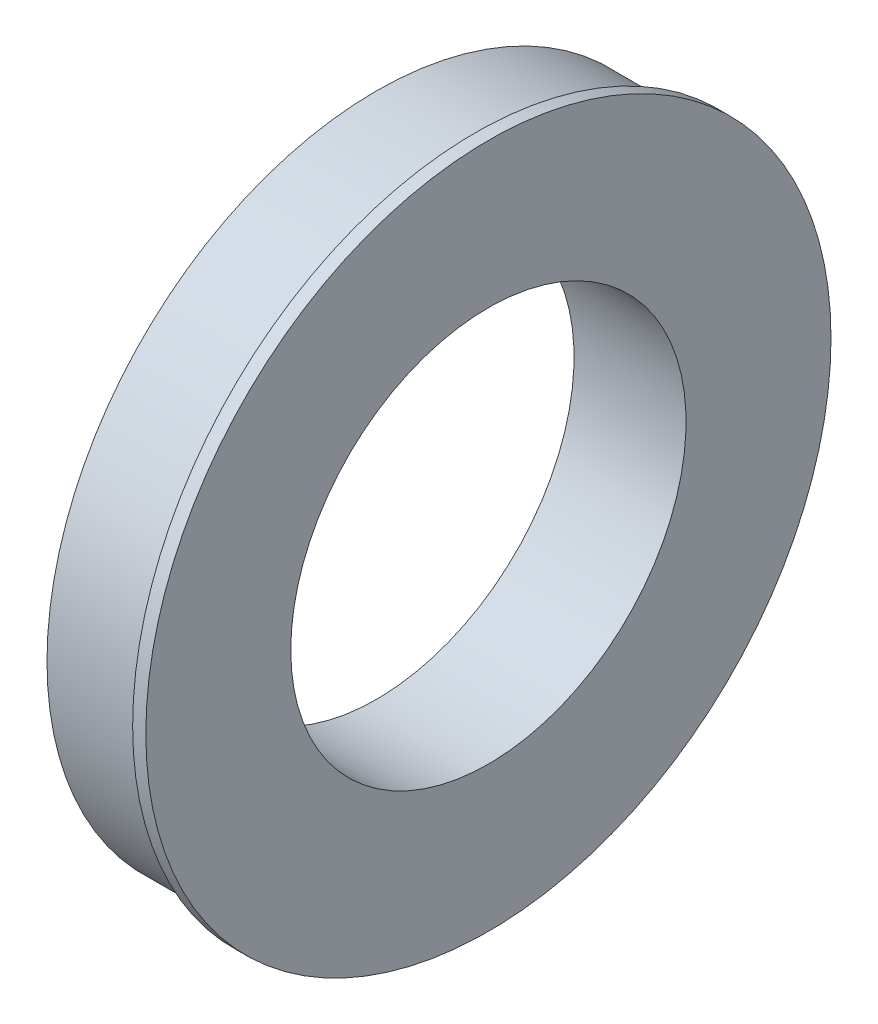
ISO-10303-21;
HEADER;
FILE_DESCRIPTION(('STEP AP214'),'2;1');
FILE_NAME('part.step','',(''),(''),'','','');
FILE_SCHEMA(('AUTOMOTIVE_DESIGN { 1 0 10303 214 1 1 1 1 }'));
ENDSEC;
DATA;
#1=APPLICATION_CONTEXT('core data for automotive mechanical design processes');
#2=APPLICATION_PROTOCOL_DEFINITION('international standard','automotive_design',2000,#1);
#3=PRODUCT_CONTEXT('',#1,'mechanical');
#4=PRODUCT('Part','Part','',(#3));
#5=PRODUCT_RELATED_PRODUCT_CATEGORY('part','',(#4));
#6=PRODUCT_DEFINITION_FORMATION('','',#4);
#7=PRODUCT_DEFINITION_CONTEXT('part definition',#1,'design');
#8=PRODUCT_DEFINITION('design','',#6,#7);
#9=PRODUCT_DEFINITION_SHAPE('','',#8);
#10=(LENGTH_UNIT() NAMED_UNIT(*) SI_UNIT(.MILLI.,.METRE.));
#11=(NAMED_UNIT(*) PLANE_ANGLE_UNIT() SI_UNIT($,.RADIAN.));
#12=(NAMED_UNIT(*) SI_UNIT($,.STERADIAN.) SOLID_ANGLE_UNIT());
#13=UNCERTAINTY_MEASURE_WITH_UNIT(LENGTH_MEASURE(1.E-05),#10,'distance_accuracy_value','');
#14=(GEOMETRIC_REPRESENTATION_CONTEXT(3) GLOBAL_UNCERTAINTY_ASSIGNED_CONTEXT((#13)) GLOBAL_UNIT_ASSIGNED_CONTEXT((#10,
#11,#12)) REPRESENTATION_CONTEXT('',''));
#15=CARTESIAN_POINT('',(0.,0.,0.));
#16=DIRECTION('',(0.,0.,1.));
#17=DIRECTION('',(1.,0.,0.));
#18=AXIS2_PLACEMENT_3D('',#15,#16,#17);
#19=CARTESIAN_POINT('',(0.,0.,0.));
#20=DIRECTION('',(1.,0.,0.));
#21=DIRECTION('',(0.,0.,-1.));
#22=AXIS2_PLACEMENT_3D('',#19,#20,#21);
#23=PLANE('',#22);
#24=CARTESIAN_POINT('',(0.,0.,0.));
#25=DIRECTION('',(1.,0.,0.));
#26=DIRECTION('',(0.,0.,-1.));
#27=AXIS2_PLACEMENT_3D('',#24,#25,#26);
#28=CIRCLE('',#27,63.5);
#29=CARTESIAN_POINT('',(0.,0.,63.5));
#30=VERTEX_POINT('',#29);
#31=EDGE_CURVE('E38',#30,#30,#28,.T.);
#32=ORIENTED_EDGE('',*,*,#31,.F.);
#33=EDGE_LOOP('',(#32));
#34=FACE_BOUND('',#33,.T.);
#35=CARTESIAN_POINT('',(0.,0.,0.));
#36=DIRECTION('',(1.,0.,0.));
#37=DIRECTION('',(0.,0.,-1.));
#38=AXIS2_PLACEMENT_3D('',#35,#36,#37);
#39=CIRCLE('',#38,38.1);
#40=CARTESIAN_POINT('',(0.,0.,38.1));
#41=VERTEX_POINT('',#40);
#42=EDGE_CURVE('E45',#41,#41,#39,.T.);
#43=ORIENTED_EDGE('',*,*,#42,.T.);
#44=EDGE_LOOP('',(#43));
#45=FACE_BOUND('',#44,.T.);
#46=ADVANCED_FACE('F34',(#34,#45),#23,.F.);
#47=CARTESIAN_POINT('',(19.05,0.,0.));
#48=DIRECTION('',(-1.,0.,0.));
#49=DIRECTION('',(0.,0.,1.));
#50=AXIS2_PLACEMENT_3D('',#47,#48,#49);
#51=CYLINDRICAL_SURFACE('',#50,63.5);
#52=CARTESIAN_POINT('',(19.05,0.,0.));
#53=DIRECTION('',(1.,0.,0.));
#54=DIRECTION('',(0.,0.,-1.));
#55=AXIS2_PLACEMENT_3D('',#52,#53,#54);
#56=CIRCLE('',#55,63.5);
#57=CARTESIAN_POINT('',(19.05,0.,63.5));
#58=VERTEX_POINT('',#57);
#59=EDGE_CURVE('E10',#58,#58,#56,.T.);
#60=CARTESIAN_POINT('',(19.05,0.,63.5));
#61=CARTESIAN_POINT('',(18.8515625,0.,63.5));
#62=CARTESIAN_POINT('',(18.653125,0.,63.5));
#63=CARTESIAN_POINT('',(18.25625,0.,63.5));
#64=CARTESIAN_POINT('',(18.0578125,0.,63.5));
#65=CARTESIAN_POINT('',(17.6609375,0.,63.5));
#66=CARTESIAN_POINT('',(17.4625,0.,63.5));
#67=CARTESIAN_POINT('',(17.065625,0.,63.5));
#68=CARTESIAN_POINT('',(16.8671875,0.,63.5));
#69=CARTESIAN_POINT('',(16.4703125,0.,63.5));
#70=CARTESIAN_POINT('',(16.271875,0.,63.5));
#71=CARTESIAN_POINT('',(15.875,0.,63.5));
#72=CARTESIAN_POINT('',(15.6765625,0.,63.5));
#73=CARTESIAN_POINT('',(15.2796875,0.,63.5));
#74=CARTESIAN_POINT('',(15.08125,0.,63.5));
#75=CARTESIAN_POINT('',(14.684375,0.,63.5));
#76=CARTESIAN_POINT('',(14.4859375,0.,63.5));
#77=CARTESIAN_POINT('',(14.0890625,0.,63.5));
#78=CARTESIAN_POINT('',(13.890625,0.,63.5));
#79=CARTESIAN_POINT('',(13.49375,0.,63.5));
#80=CARTESIAN_POINT('',(13.2953125,0.,63.5));
#81=CARTESIAN_POINT('',(12.8984375,0.,63.5));
#82=CARTESIAN_POINT('',(12.7,0.,63.5));
#83=CARTESIAN_POINT('',(12.303125,0.,63.5));
#84=CARTESIAN_POINT('',(12.1046875,0.,63.5));
#85=CARTESIAN_POINT('',(11.7078125,0.,63.5));
#86=CARTESIAN_POINT('',(11.509375,0.,63.5));
#87=CARTESIAN_POINT('',(11.1125,0.,63.5));
#88=CARTESIAN_POINT('',(10.9140625,0.,63.5));
#89=CARTESIAN_POINT('',(10.5171875,0.,63.5));
#90=CARTESIAN_POINT('',(10.31875,0.,63.5));
#91=CARTESIAN_POINT('',(9.921875,0.,63.5));
#92=CARTESIAN_POINT('',(9.7234375,0.,63.5));
#93=CARTESIAN_POINT('',(9.3265625,0.,63.5));
#94=CARTESIAN_POINT('',(9.128125,0.,63.5));
#95=CARTESIAN_POINT('',(8.73125,0.,63.5));
#96=CARTESIAN_POINT('',(8.5328125,0.,63.5));
#97=CARTESIAN_POINT('',(8.1359375,0.,63.5));
#98=CARTESIAN_POINT('',(7.9375,0.,63.5));
#99=CARTESIAN_POINT('',(7.540625,0.,63.5));
#100=CARTESIAN_POINT('',(7.3421875,0.,63.5));
#101=CARTESIAN_POINT('',(6.9453125,0.,63.5));
#102=CARTESIAN_POINT('',(6.746875,0.,63.5));
#103=CARTESIAN_POINT('',(6.35,0.,63.5));
#104=CARTESIAN_POINT('',(6.1515625,0.,63.5));
#105=CARTESIAN_POINT('',(5.7546875,0.,63.5));
#106=CARTESIAN_POINT('',(5.55625,0.,63.5));
#107=CARTESIAN_POINT('',(5.159375,0.,63.5));
#108=CARTESIAN_POINT('',(4.9609375,0.,63.5));
#109=CARTESIAN_POINT('',(4.5640625,0.,63.5));
#110=CARTESIAN_POINT('',(4.365625,0.,63.5));
#111=CARTESIAN_POINT('',(3.96875,0.,63.5));
#112=CARTESIAN_POINT('',(3.7703125,0.,63.5));
#113=CARTESIAN_POINT('',(3.3734375,0.,63.5));
#114=CARTESIAN_POINT('',(3.175,0.,63.5));
#115=CARTESIAN_POINT('',(2.778125,0.,63.5));
#116=CARTESIAN_POINT('',(2.5796875,0.,63.5));
#117=CARTESIAN_POINT('',(2.1828125,0.,63.5));
#118=CARTESIAN_POINT('',(1.984375,0.,63.5));
#119=CARTESIAN_POINT('',(1.5875,0.,63.5));
#120=CARTESIAN_POINT('',(1.3890625,0.,63.5));
#121=CARTESIAN_POINT('',(0.992187500000001,0.,63.5));
#122=CARTESIAN_POINT('',(0.793750000000001,0.,63.5));
#123=CARTESIAN_POINT('',(0.396875,0.,63.5));
#124=CARTESIAN_POINT('',(0.1984375,0.,63.5));
#125=CARTESIAN_POINT('',(0.,0.,63.5));
#126=B_SPLINE_CURVE_WITH_KNOTS('',3,(#60,#61,#62,#63,#64,#65,#66,#67,#68,#69,#70,#71,#72,#73,
#74,#75,#76,#77,#78,#79,#80,#81,#82,#83,#84,#85,#86,#87,#88,#89,#90,#91,#92,#93,#94,#95,#96,#97,
#98,#99,#100,#101,#102,#103,#104,#105,#106,#107,#108,#109,#110,#111,#112,#113,#114,#115,#116,
#117,#118,#119,#120,#121,#122,#123,#124,#125),.UNSPECIFIED.,.F.,.F.,(4,2,2,2,2,2,2,2,2,2,2,2,2,
2,2,2,2,2,2,2,2,2,2,2,2,2,2,2,2,2,2,2,4),(0.,0.5953125,1.190625,1.7859375,2.38125,2.9765625,
3.571875,4.1671875,4.7625,5.3578125,5.953125,6.5484375,7.14375,7.7390625,8.334375,8.9296875,
9.525,10.1203125,10.715625,11.3109375,11.90625,12.5015625,13.096875,13.6921875,14.2875,
14.8828125,15.478125,16.0734375,16.66875,17.2640625,17.859375,18.4546875,19.05),.UNSPECIFIED.);
#127=EDGE_CURVE('BSEAM36',#58,#30,#126,.T.);
#128=ORIENTED_EDGE('',*,*,#59,.F.);
#129=ORIENTED_EDGE('',*,*,#31,.T.);
#130=ORIENTED_EDGE('',*,*,#127,.T.);
#131=ORIENTED_EDGE('',*,*,#127,.F.);
#132=EDGE_LOOP('',(#128,#130,#129,#131));
#133=FACE_BOUND('',#132,.T.);
#134=ADVANCED_FACE('F36',(#133),#51,.T.);
#135=CARTESIAN_POINT('',(19.05,0.,0.));
#136=DIRECTION('',(-1.,0.,0.));
#137=DIRECTION('',(0.,0.,1.));
#138=AXIS2_PLACEMENT_3D('',#135,#136,#137);
#139=CYLINDRICAL_SURFACE('',#138,38.1);
#140=CARTESIAN_POINT('',(21.59,0.,0.));
#141=DIRECTION('',(1.,0.,0.));
#142=DIRECTION('',(0.,0.,-1.));
#143=AXIS2_PLACEMENT_3D('',#140,#141,#142);
#144=CIRCLE('',#143,38.1);
#145=CARTESIAN_POINT('',(21.59,0.,38.1));
#146=VERTEX_POINT('',#145);
#147=EDGE_CURVE('E53',#146,#146,#144,.T.);
#148=CARTESIAN_POINT('',(0.,0.,38.1));
#149=CARTESIAN_POINT('',(0.224895833333333,0.,38.1));
#150=CARTESIAN_POINT('',(0.449791666666667,0.,38.1));
#151=CARTESIAN_POINT('',(0.899583333333333,0.,38.1));
#152=CARTESIAN_POINT('',(1.12447916666667,0.,38.1));
#153=CARTESIAN_POINT('',(1.57427083333333,0.,38.1));
#154=CARTESIAN_POINT('',(1.79916666666667,0.,38.1));
#155=CARTESIAN_POINT('',(2.24895833333333,0.,38.1));
#156=CARTESIAN_POINT('',(2.47385416666667,0.,38.1));
#157=CARTESIAN_POINT('',(2.92364583333333,0.,38.1));
#158=CARTESIAN_POINT('',(3.14854166666667,0.,38.1));
#159=CARTESIAN_POINT('',(3.59833333333333,0.,38.1));
#160=CARTESIAN_POINT('',(3.82322916666667,0.,38.1));
#161=CARTESIAN_POINT('',(4.27302083333333,0.,38.1));
#162=CARTESIAN_POINT('',(4.49791666666667,0.,38.1));
#163=CARTESIAN_POINT('',(4.94770833333333,0.,38.1));
#164=CARTESIAN_POINT('',(5.17260416666667,0.,38.1));
#165=CARTESIAN_POINT('',(5.62239583333333,0.,38.1));
#166=CARTESIAN_POINT('',(5.84729166666667,0.,38.1));
#167=CARTESIAN_POINT('',(6.29708333333333,0.,38.1));
#168=CARTESIAN_POINT('',(6.52197916666667,0.,38.1));
#169=CARTESIAN_POINT('',(6.97177083333333,0.,38.1));
#170=CARTESIAN_POINT('',(7.19666666666667,0.,38.1));
#171=CARTESIAN_POINT('',(7.64645833333333,0.,38.1));
#172=CARTESIAN_POINT('',(7.87135416666667,0.,38.1));
#173=CARTESIAN_POINT('',(8.32114583333333,0.,38.1));
#174=CARTESIAN_POINT('',(8.54604166666667,0.,38.1));
#175=CARTESIAN_POINT('',(8.99583333333334,0.,38.1));
#176=CARTESIAN_POINT('',(9.22072916666667,0.,38.1));
#177=CARTESIAN_POINT('',(9.67052083333333,0.,38.1));
#178=CARTESIAN_POINT('',(9.89541666666667,0.,38.1));
#179=CARTESIAN_POINT('',(10.3452083333333,0.,38.1));
#180=CARTESIAN_POINT('',(10.5701041666667,0.,38.1));
#181=CARTESIAN_POINT('',(11.0198958333333,0.,38.1));
#182=CARTESIAN_POINT('',(11.2447916666667,0.,38.1));
#183=CARTESIAN_POINT('',(11.6945833333333,0.,38.1));
#184=CARTESIAN_POINT('',(11.9194791666667,0.,38.1));
#185=CARTESIAN_POINT('',(12.3692708333333,0.,38.1));
#186=CARTESIAN_POINT('',(12.5941666666667,0.,38.1));
#187=CARTESIAN_POINT('',(13.0439583333333,0.,38.1));
#188=CARTESIAN_POINT('',(13.2688541666667,0.,38.1));
#189=CARTESIAN_POINT('',(13.7186458333333,0.,38.1));
#190=CARTESIAN_POINT('',(13.9435416666667,0.,38.1));
#191=CARTESIAN_POINT('',(14.3933333333333,0.,38.1));
#192=CARTESIAN_POINT('',(14.6182291666667,0.,38.1));
#193=CARTESIAN_POINT('',(15.0680208333333,0.,38.1));
#194=CARTESIAN_POINT('',(15.2929166666667,0.,38.1));
#195=CARTESIAN_POINT('',(15.7427083333333,0.,38.1));
#196=CARTESIAN_POINT('',(15.9676041666667,0.,38.1));
#197=CARTESIAN_POINT('',(16.4173958333333,0.,38.1));
#198=CARTESIAN_POINT('',(16.6422916666667,0.,38.1));
#199=CARTESIAN_POINT('',(17.0920833333333,0.,38.1));
#200=CARTESIAN_POINT('',(17.3169791666667,0.,38.1));
#201=CARTESIAN_POINT('',(17.7667708333333,0.,38.1));
#202=CARTESIAN_POINT('',(17.9916666666667,0.,38.1));
#203=CARTESIAN_POINT('',(18.4414583333333,0.,38.1));
#204=CARTESIAN_POINT('',(18.6663541666667,0.,38.1));
#205=CARTESIAN_POINT('',(19.1161458333333,0.,38.1));
#206=CARTESIAN_POINT('',(19.3410416666667,0.,38.1));
#207=CARTESIAN_POINT('',(19.7908333333333,0.,38.1));
#208=CARTESIAN_POINT('',(20.0157291666667,0.,38.1));
#209=CARTESIAN_POINT('',(20.4655208333333,0.,38.1));
#210=CARTESIAN_POINT('',(20.6904166666667,0.,38.1));
#211=CARTESIAN_POINT('',(21.1402083333333,0.,38.1));
#212=CARTESIAN_POINT('',(21.3651041666667,0.,38.1));
#213=CARTESIAN_POINT('',(21.59,0.,38.1));
#214=B_SPLINE_CURVE_WITH_KNOTS('',3,(#148,#149,#150,#151,#152,#153,#154,#155,#156,#157,#158,
#159,#160,#161,#162,#163,#164,#165,#166,#167,#168,#169,#170,#171,#172,#173,#174,#175,#176,#177,
#178,#179,#180,#181,#182,#183,#184,#185,#186,#187,#188,#189,#190,#191,#192,#193,#194,#195,#196,
#197,#198,#199,#200,#201,#202,#203,#204,#205,#206,#207,#208,#209,#210,#211,#212,#213),
.UNSPECIFIED.,.F.,.F.,(4,2,2,2,2,2,2,2,2,2,2,2,2,2,2,2,2,2,2,2,2,2,2,2,2,2,2,2,2,2,2,2,4),(0.,
0.6746875,1.349375,2.0240625,2.69875,3.3734375,4.048125,4.7228125,5.3975,6.0721875,6.746875,
7.4215625,8.09625,8.7709375,9.445625,10.1203125,10.795,11.4696875,12.144375,12.8190625,13.49375,
14.1684375,14.843125,15.5178125,16.1925,16.8671875,17.541875,18.2165625,18.89125,19.5659375,
20.240625,20.9153125,21.59),.UNSPECIFIED.);
#215=EDGE_CURVE('BSEAM59',#41,#146,#214,.T.);
#216=ORIENTED_EDGE('',*,*,#42,.F.);
#217=ORIENTED_EDGE('',*,*,#147,.T.);
#218=ORIENTED_EDGE('',*,*,#215,.T.);
#219=ORIENTED_EDGE('',*,*,#215,.F.);
#220=EDGE_LOOP('',(#216,#218,#217,#219));
#221=FACE_BOUND('',#220,.T.);
#222=ADVANCED_FACE('F59',(#221),#139,.F.);
#223=CARTESIAN_POINT('',(21.59,0.,0.));
#224=DIRECTION('',(1.,0.,0.));
#225=DIRECTION('',(0.,0.,-1.));
#226=AXIS2_PLACEMENT_3D('',#223,#224,#225);
#227=PLANE('',#226);
#228=CARTESIAN_POINT('',(21.59,0.,0.));
#229=DIRECTION('',(1.,0.,0.));
#230=DIRECTION('',(0.,0.,-1.));
#231=AXIS2_PLACEMENT_3D('',#228,#229,#230);
#232=CIRCLE('',#231,66.04);
#233=CARTESIAN_POINT('',(21.59,0.,-66.04));
#234=VERTEX_POINT('',#233);
#235=EDGE_CURVE('E49',#234,#234,#232,.T.);
#236=ORIENTED_EDGE('',*,*,#235,.T.);
#237=EDGE_LOOP('',(#236));
#238=FACE_BOUND('',#237,.T.);
#239=ORIENTED_EDGE('',*,*,#147,.F.);
#240=EDGE_LOOP('',(#239));
#241=FACE_BOUND('',#240,.T.);
#242=ADVANCED_FACE('F61',(#238,#241),#227,.T.);
#243=CARTESIAN_POINT('',(19.05,0.,0.));
#244=DIRECTION('',(1.,0.,0.));
#245=DIRECTION('',(0.,0.,-1.));
#246=AXIS2_PLACEMENT_3D('',#243,#244,#245);
#247=PLANE('',#246);
#248=ORIENTED_EDGE('',*,*,#59,.T.);
#249=EDGE_LOOP('',(#248));
#250=FACE_BOUND('',#249,.T.);
#251=CARTESIAN_POINT('',(19.05,0.,0.));
#252=DIRECTION('',(1.,0.,0.));
#253=DIRECTION('',(0.,0.,-1.));
#254=AXIS2_PLACEMENT_3D('',#251,#252,#253);
#255=CIRCLE('',#254,66.04);
#256=CARTESIAN_POINT('',(19.05,0.,-66.04));
#257=VERTEX_POINT('',#256);
#258=EDGE_CURVE('E50',#257,#257,#255,.T.);
#259=ORIENTED_EDGE('',*,*,#258,.F.);
#260=EDGE_LOOP('',(#259));
#261=FACE_BOUND('',#260,.T.);
#262=ADVANCED_FACE('F63',(#250,#261),#247,.F.);
#263=CARTESIAN_POINT('',(21.59,0.,0.));
#264=DIRECTION('',(-1.,0.,0.));
#265=DIRECTION('',(0.,0.,1.));
#266=AXIS2_PLACEMENT_3D('',#263,#264,#265);
#267=CYLINDRICAL_SURFACE('',#266,66.04);
#268=ORIENTED_EDGE('',*,*,#235,.F.);
#269=EDGE_LOOP('',(#268));
#270=FACE_BOUND('',#269,.T.);
#271=ORIENTED_EDGE('',*,*,#258,.T.);
#272=EDGE_LOOP('',(#271));
#273=FACE_BOUND('',#272,.T.);
#274=ADVANCED_FACE('F70',(#270,#273),#267,.T.);
#275=CLOSED_SHELL('',(#46,#134,#222,#242,#262,#274));
#276=MANIFOLD_SOLID_BREP('B2',#275);
#277=ADVANCED_BREP_SHAPE_REPRESENTATION('',(#18,#276),#14);
#278=SHAPE_DEFINITION_REPRESENTATION(#9,#277);
ENDSEC;
END-ISO-10303-21;
